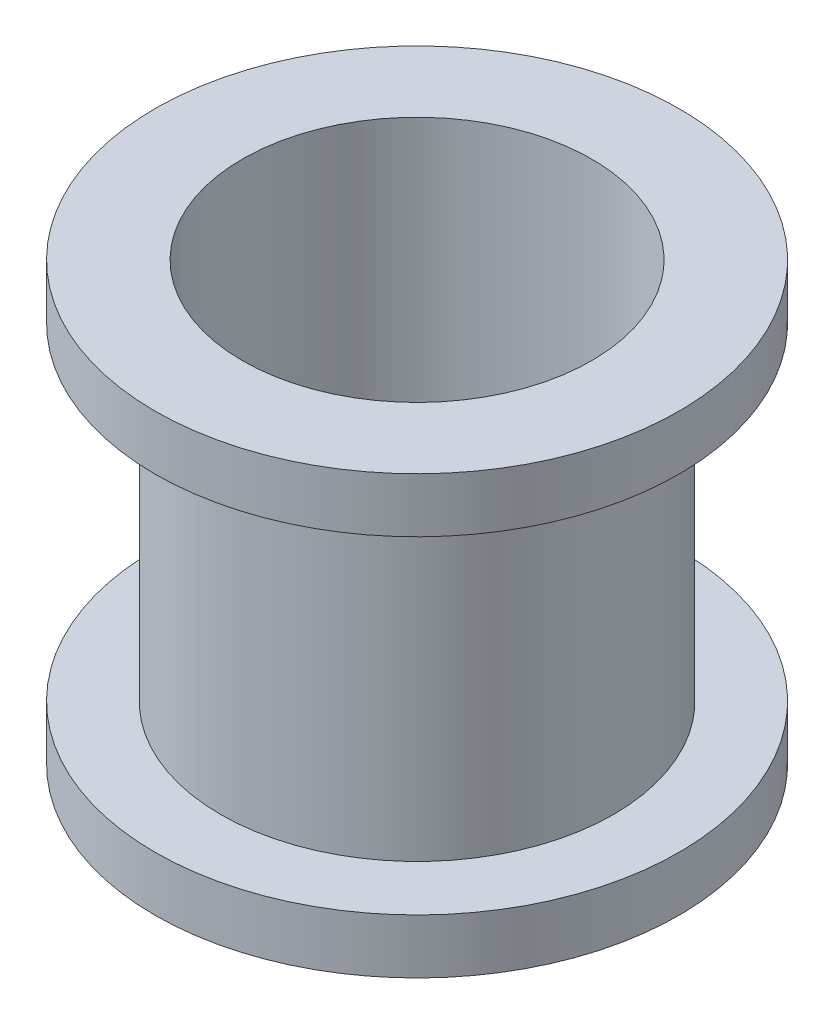
ISO-10303-21;
HEADER;
FILE_DESCRIPTION(('STEP AP214'),'2;1');
FILE_NAME('part.step','',(''),(''),'','','');
FILE_SCHEMA(('AUTOMOTIVE_DESIGN { 1 0 10303 214 1 1 1 1 }'));
ENDSEC;
DATA;
#1=APPLICATION_CONTEXT('core data for automotive mechanical design processes');
#2=APPLICATION_PROTOCOL_DEFINITION('international standard','automotive_design',2000,#1);
#3=PRODUCT_CONTEXT('',#1,'mechanical');
#4=PRODUCT('Part','Part','',(#3));
#5=PRODUCT_RELATED_PRODUCT_CATEGORY('part','',(#4));
#6=PRODUCT_DEFINITION_FORMATION('','',#4);
#7=PRODUCT_DEFINITION_CONTEXT('part definition',#1,'design');
#8=PRODUCT_DEFINITION('design','',#6,#7);
#9=PRODUCT_DEFINITION_SHAPE('','',#8);
#10=(LENGTH_UNIT() NAMED_UNIT(*) SI_UNIT(.MILLI.,.METRE.));
#11=(NAMED_UNIT(*) PLANE_ANGLE_UNIT() SI_UNIT($,.RADIAN.));
#12=(NAMED_UNIT(*) SI_UNIT($,.STERADIAN.) SOLID_ANGLE_UNIT());
#13=UNCERTAINTY_MEASURE_WITH_UNIT(LENGTH_MEASURE(1.E-05),#10,'distance_accuracy_value','');
#14=(GEOMETRIC_REPRESENTATION_CONTEXT(3) GLOBAL_UNCERTAINTY_ASSIGNED_CONTEXT((#13)) GLOBAL_UNIT_ASSIGNED_CONTEXT((#10,
#11,#12)) REPRESENTATION_CONTEXT('',''));
#15=CARTESIAN_POINT('',(0.,0.,0.));
#16=DIRECTION('',(0.,0.,1.));
#17=DIRECTION('',(1.,0.,0.));
#18=AXIS2_PLACEMENT_3D('',#15,#16,#17);
#19=CARTESIAN_POINT('',(0.,15.,0.));
#20=DIRECTION('',(0.,-1.,0.));
#21=DIRECTION('',(0.,0.,-1.));
#22=AXIS2_PLACEMENT_3D('',#19,#20,#21);
#23=CYLINDRICAL_SURFACE('',#22,18.);
#24=CARTESIAN_POINT('',(0.,15.,0.));
#25=DIRECTION('',(0.,1.,0.));
#26=DIRECTION('',(0.,0.,1.));
#27=AXIS2_PLACEMENT_3D('',#24,#25,#26);
#28=CIRCLE('',#27,18.);
#29=CARTESIAN_POINT('',(0.,15.,18.));
#30=VERTEX_POINT('',#29);
#31=EDGE_CURVE('E10',#30,#30,#28,.T.);
#32=ORIENTED_EDGE('',*,*,#31,.F.);
#33=EDGE_LOOP('',(#32));
#34=FACE_BOUND('',#33,.T.);
#35=CARTESIAN_POINT('',(0.,-15.,0.));
#36=DIRECTION('',(0.,1.,0.));
#37=DIRECTION('',(0.,0.,1.));
#38=AXIS2_PLACEMENT_3D('',#35,#36,#37);
#39=CIRCLE('',#38,18.);
#40=CARTESIAN_POINT('',(0.,-15.,18.));
#41=VERTEX_POINT('',#40);
#42=EDGE_CURVE('E35',#41,#41,#39,.T.);
#43=ORIENTED_EDGE('',*,*,#42,.T.);
#44=EDGE_LOOP('',(#43));
#45=FACE_BOUND('',#44,.T.);
#46=ADVANCED_FACE('F32',(#34,#45),#23,.T.);
#47=CARTESIAN_POINT('',(0.,20.,0.));
#48=DIRECTION('',(0.,-1.,0.));
#49=DIRECTION('',(0.,0.,-1.));
#50=AXIS2_PLACEMENT_3D('',#47,#48,#49);
#51=CYLINDRICAL_SURFACE('',#50,24.);
#52=CARTESIAN_POINT('',(0.,20.,0.));
#53=DIRECTION('',(0.,1.,0.));
#54=DIRECTION('',(0.,0.,1.));
#55=AXIS2_PLACEMENT_3D('',#52,#53,#54);
#56=CIRCLE('',#55,24.);
#57=CARTESIAN_POINT('',(0.,20.,24.));
#58=VERTEX_POINT('',#57);
#59=EDGE_CURVE('E39',#58,#58,#56,.T.);
#60=ORIENTED_EDGE('',*,*,#59,.F.);
#61=EDGE_LOOP('',(#60));
#62=FACE_BOUND('',#61,.T.);
#63=CARTESIAN_POINT('',(0.,15.,0.));
#64=DIRECTION('',(0.,1.,0.));
#65=DIRECTION('',(0.,0.,1.));
#66=AXIS2_PLACEMENT_3D('',#63,#64,#65);
#67=CIRCLE('',#66,24.);
#68=CARTESIAN_POINT('',(0.,15.,24.));
#69=VERTEX_POINT('',#68);
#70=EDGE_CURVE('E43',#69,#69,#67,.T.);
#71=ORIENTED_EDGE('',*,*,#70,.T.);
#72=EDGE_LOOP('',(#71));
#73=FACE_BOUND('',#72,.T.);
#74=ADVANCED_FACE('F67',(#62,#73),#51,.T.);
#75=CARTESIAN_POINT('',(0.,20.,0.));
#76=DIRECTION('',(0.,1.,0.));
#77=DIRECTION('',(0.,0.,1.));
#78=AXIS2_PLACEMENT_3D('',#75,#76,#77);
#79=PLANE('',#78);
#80=CARTESIAN_POINT('',(0.,20.,0.));
#81=DIRECTION('',(0.,1.,0.));
#82=DIRECTION('',(0.,0.,1.));
#83=AXIS2_PLACEMENT_3D('',#80,#81,#82);
#84=CIRCLE('',#83,16.);
#85=CARTESIAN_POINT('',(0.,20.,16.));
#86=VERTEX_POINT('',#85);
#87=EDGE_CURVE('E57',#86,#86,#84,.T.);
#88=ORIENTED_EDGE('',*,*,#87,.F.);
#89=EDGE_LOOP('',(#88));
#90=FACE_BOUND('',#89,.T.);
#91=ORIENTED_EDGE('',*,*,#59,.T.);
#92=EDGE_LOOP('',(#91));
#93=FACE_BOUND('',#92,.T.);
#94=ADVANCED_FACE('F63',(#90,#93),#79,.T.);
#95=CARTESIAN_POINT('',(0.,15.,0.));
#96=DIRECTION('',(0.,1.,0.));
#97=DIRECTION('',(0.,0.,1.));
#98=AXIS2_PLACEMENT_3D('',#95,#96,#97);
#99=PLANE('',#98);
#100=ORIENTED_EDGE('',*,*,#31,.T.);
#101=EDGE_LOOP('',(#100));
#102=FACE_BOUND('',#101,.T.);
#103=ORIENTED_EDGE('',*,*,#70,.F.);
#104=EDGE_LOOP('',(#103));
#105=FACE_BOUND('',#104,.T.);
#106=ADVANCED_FACE('F66',(#102,#105),#99,.F.);
#107=CARTESIAN_POINT('',(0.,-20.,0.));
#108=DIRECTION('',(0.,1.,0.));
#109=DIRECTION('',(0.,0.,1.));
#110=AXIS2_PLACEMENT_3D('',#107,#108,#109);
#111=CYLINDRICAL_SURFACE('',#110,24.);
#112=CARTESIAN_POINT('',(0.,-20.,0.));
#113=DIRECTION('',(0.,1.,0.));
#114=DIRECTION('',(0.,0.,1.));
#115=AXIS2_PLACEMENT_3D('',#112,#113,#114);
#116=CIRCLE('',#115,24.);
#117=CARTESIAN_POINT('',(0.,-20.,24.));
#118=VERTEX_POINT('',#117);
#119=EDGE_CURVE('E51',#118,#118,#116,.T.);
#120=ORIENTED_EDGE('',*,*,#119,.T.);
#121=EDGE_LOOP('',(#120));
#122=FACE_BOUND('',#121,.T.);
#123=CARTESIAN_POINT('',(0.,-15.,0.));
#124=DIRECTION('',(0.,1.,0.));
#125=DIRECTION('',(0.,0.,1.));
#126=AXIS2_PLACEMENT_3D('',#123,#124,#125);
#127=CIRCLE('',#126,24.);
#128=CARTESIAN_POINT('',(0.,-15.,24.));
#129=VERTEX_POINT('',#128);
#130=EDGE_CURVE('E48',#129,#129,#127,.T.);
#131=ORIENTED_EDGE('',*,*,#130,.F.);
#132=EDGE_LOOP('',(#131));
#133=FACE_BOUND('',#132,.T.);
#134=ADVANCED_FACE('F76',(#122,#133),#111,.T.);
#135=CARTESIAN_POINT('',(0.,-20.,0.));
#136=DIRECTION('',(0.,-1.,0.));
#137=DIRECTION('',(0.,0.,1.));
#138=AXIS2_PLACEMENT_3D('',#135,#136,#137);
#139=PLANE('',#138);
#140=CARTESIAN_POINT('',(0.,-20.,0.));
#141=DIRECTION('',(0.,1.,0.));
#142=DIRECTION('',(0.,0.,1.));
#143=AXIS2_PLACEMENT_3D('',#140,#141,#142);
#144=CIRCLE('',#143,16.);
#145=CARTESIAN_POINT('',(0.,-20.,16.));
#146=VERTEX_POINT('',#145);
#147=EDGE_CURVE('E52',#146,#146,#144,.T.);
#148=ORIENTED_EDGE('',*,*,#147,.T.);
#149=EDGE_LOOP('',(#148));
#150=FACE_BOUND('',#149,.T.);
#151=ORIENTED_EDGE('',*,*,#119,.F.);
#152=EDGE_LOOP('',(#151));
#153=FACE_BOUND('',#152,.T.);
#154=ADVANCED_FACE('F81',(#150,#153),#139,.T.);
#155=CARTESIAN_POINT('',(0.,-15.,0.));
#156=DIRECTION('',(0.,-1.,0.));
#157=DIRECTION('',(0.,0.,1.));
#158=AXIS2_PLACEMENT_3D('',#155,#156,#157);
#159=PLANE('',#158);
#160=ORIENTED_EDGE('',*,*,#42,.F.);
#161=EDGE_LOOP('',(#160));
#162=FACE_BOUND('',#161,.T.);
#163=ORIENTED_EDGE('',*,*,#130,.T.);
#164=EDGE_LOOP('',(#163));
#165=FACE_BOUND('',#164,.T.);
#166=ADVANCED_FACE('F92',(#162,#165),#159,.F.);
#167=CARTESIAN_POINT('',(0.,-20.,0.));
#168=DIRECTION('',(0.,1.,0.));
#169=DIRECTION('',(0.,0.,1.));
#170=AXIS2_PLACEMENT_3D('',#167,#168,#169);
#171=CYLINDRICAL_SURFACE('',#170,16.);
#172=ORIENTED_EDGE('',*,*,#147,.F.);
#173=EDGE_LOOP('',(#172));
#174=FACE_BOUND('',#173,.T.);
#175=ORIENTED_EDGE('',*,*,#87,.T.);
#176=EDGE_LOOP('',(#175));
#177=FACE_BOUND('',#176,.T.);
#178=ADVANCED_FACE('F61',(#174,#177),#171,.F.);
#179=CLOSED_SHELL('',(#46,#74,#94,#106,#134,#154,#166,#178));
#180=MANIFOLD_SOLID_BREP('B2',#179);
#181=ADVANCED_BREP_SHAPE_REPRESENTATION('',(#18,#180),#14);
#182=SHAPE_DEFINITION_REPRESENTATION(#9,#181);
ENDSEC;
END-ISO-10303-21;
